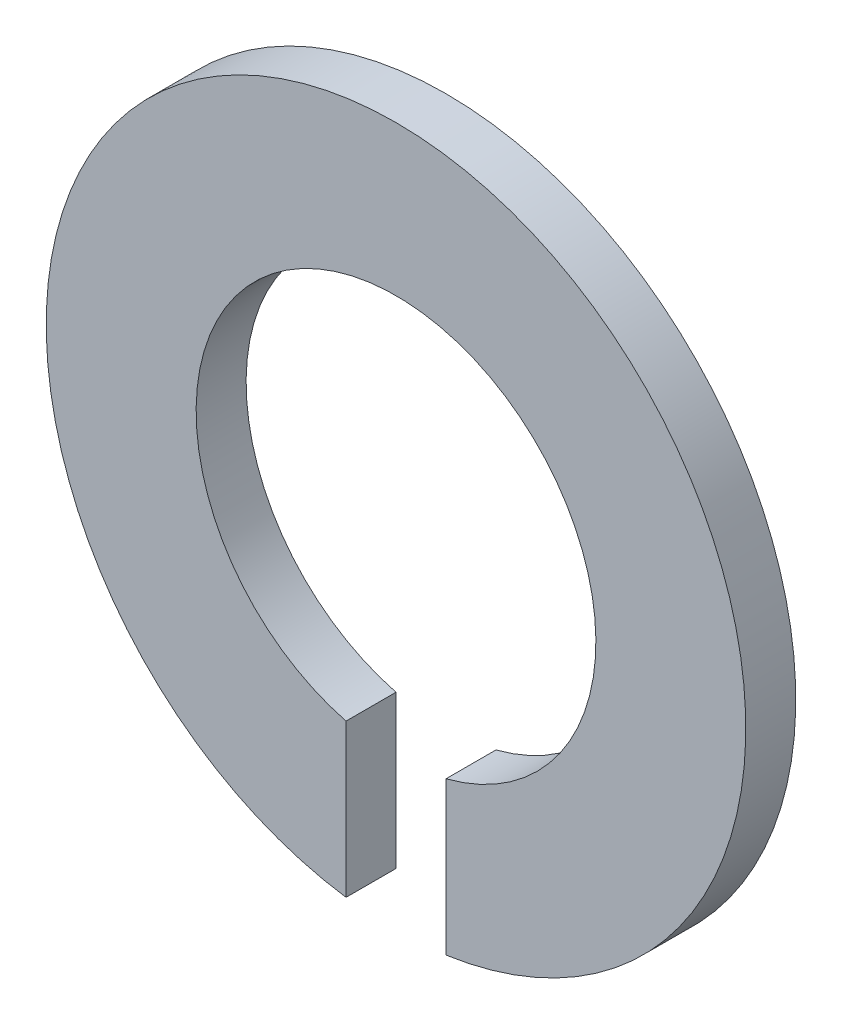
ISO-10303-21;
HEADER;
FILE_DESCRIPTION(('STEP AP214'),'2;1');
FILE_NAME('part.step','',(''),(''),'','','');
FILE_SCHEMA(('AUTOMOTIVE_DESIGN { 1 0 10303 214 1 1 1 1 }'));
ENDSEC;
DATA;
#1=APPLICATION_CONTEXT('core data for automotive mechanical design processes');
#2=APPLICATION_PROTOCOL_DEFINITION('international standard','automotive_design',2000,#1);
#3=PRODUCT_CONTEXT('',#1,'mechanical');
#4=PRODUCT('Part','Part','',(#3));
#5=PRODUCT_RELATED_PRODUCT_CATEGORY('part','',(#4));
#6=PRODUCT_DEFINITION_FORMATION('','',#4);
#7=PRODUCT_DEFINITION_CONTEXT('part definition',#1,'design');
#8=PRODUCT_DEFINITION('design','',#6,#7);
#9=PRODUCT_DEFINITION_SHAPE('','',#8);
#10=(LENGTH_UNIT() NAMED_UNIT(*) SI_UNIT(.MILLI.,.METRE.));
#11=(NAMED_UNIT(*) PLANE_ANGLE_UNIT() SI_UNIT($,.RADIAN.));
#12=(NAMED_UNIT(*) SI_UNIT($,.STERADIAN.) SOLID_ANGLE_UNIT());
#13=UNCERTAINTY_MEASURE_WITH_UNIT(LENGTH_MEASURE(1.E-05),#10,'distance_accuracy_value','');
#14=(GEOMETRIC_REPRESENTATION_CONTEXT(3) GLOBAL_UNCERTAINTY_ASSIGNED_CONTEXT((#13)) GLOBAL_UNIT_ASSIGNED_CONTEXT((#10,
#11,#12)) REPRESENTATION_CONTEXT('',''));
#15=CARTESIAN_POINT('',(0.,0.,0.));
#16=DIRECTION('',(0.,0.,1.));
#17=DIRECTION('',(1.,0.,0.));
#18=AXIS2_PLACEMENT_3D('',#15,#16,#17);
#19=CARTESIAN_POINT('',(0.,0.,0.5));
#20=DIRECTION('',(0.,0.,-1.));
#21=DIRECTION('',(-1.,0.,0.));
#22=AXIS2_PLACEMENT_3D('',#19,#20,#21);
#23=CYLINDRICAL_SURFACE('',#22,3.5);
#24=CARTESIAN_POINT('',(0.,0.,0.));
#25=DIRECTION('',(0.,0.,1.));
#26=DIRECTION('',(1.,0.,0.));
#27=AXIS2_PLACEMENT_3D('',#24,#25,#26);
#28=CIRCLE('',#27,3.5);
#29=CARTESIAN_POINT('',(0.5,-3.46410161513775,0.));
#30=VERTEX_POINT('',#29);
#31=CARTESIAN_POINT('',(-0.5,-3.46410161513775,0.));
#32=VERTEX_POINT('',#31);
#33=EDGE_CURVE('E113',#30,#32,#28,.T.);
#34=ORIENTED_EDGE('',*,*,#33,.T.);
#35=DIRECTION('',(0.,0.,-1.));
#36=VECTOR('',#35,1.);
#37=CARTESIAN_POINT('',(-0.5,-3.46410161513775,0.5));
#38=LINE('',#37,#36);
#39=CARTESIAN_POINT('',(-0.5,-3.46410161513775,0.5));
#40=VERTEX_POINT('',#39);
#41=EDGE_CURVE('E11',#40,#32,#38,.T.);
#42=ORIENTED_EDGE('',*,*,#41,.F.);
#43=CARTESIAN_POINT('',(0.,0.,0.5));
#44=DIRECTION('',(0.,0.,1.));
#45=DIRECTION('',(1.,0.,0.));
#46=AXIS2_PLACEMENT_3D('',#43,#44,#45);
#47=CIRCLE('',#46,3.5);
#48=CARTESIAN_POINT('',(0.5,-3.46410161513775,0.5));
#49=VERTEX_POINT('',#48);
#50=EDGE_CURVE('E97',#49,#40,#47,.T.);
#51=ORIENTED_EDGE('',*,*,#50,.F.);
#52=DIRECTION('',(0.,0.,-1.));
#53=VECTOR('',#52,1.);
#54=CARTESIAN_POINT('',(0.5,-3.46410161513775,0.5));
#55=LINE('',#54,#53);
#56=EDGE_CURVE('E109',#49,#30,#55,.T.);
#57=ORIENTED_EDGE('',*,*,#56,.T.);
#58=EDGE_LOOP('',(#34,#42,#51,#57));
#59=FACE_BOUND('',#58,.T.);
#60=ADVANCED_FACE('F45',(#59),#23,.T.);
#61=CARTESIAN_POINT('',(-0.5,-3.46410161513775,0.5));
#62=DIRECTION('',(-1.,0.,0.));
#63=DIRECTION('',(0.,0.,1.));
#64=AXIS2_PLACEMENT_3D('',#61,#62,#63);
#65=PLANE('',#64);
#66=DIRECTION('',(0.,1.,0.));
#67=VECTOR('',#66,1.);
#68=CARTESIAN_POINT('',(-0.5,-3.46410161513775,0.));
#69=LINE('',#68,#67);
#70=CARTESIAN_POINT('',(-0.5,-1.93649167310371,0.));
#71=VERTEX_POINT('',#70);
#72=EDGE_CURVE('E102',#32,#71,#69,.T.);
#73=ORIENTED_EDGE('',*,*,#72,.T.);
#74=DIRECTION('',(0.,0.,-1.));
#75=VECTOR('',#74,1.);
#76=CARTESIAN_POINT('',(-0.5,-1.93649167310371,0.5));
#77=LINE('',#76,#75);
#78=CARTESIAN_POINT('',(-0.5,-1.93649167310371,0.5));
#79=VERTEX_POINT('',#78);
#80=EDGE_CURVE('E54',#79,#71,#77,.T.);
#81=ORIENTED_EDGE('',*,*,#80,.F.);
#82=DIRECTION('',(0.,1.,0.));
#83=VECTOR('',#82,1.);
#84=CARTESIAN_POINT('',(-0.5,-3.46410161513775,0.5));
#85=LINE('',#84,#83);
#86=EDGE_CURVE('E92',#40,#79,#85,.T.);
#87=ORIENTED_EDGE('',*,*,#86,.F.);
#88=ORIENTED_EDGE('',*,*,#41,.T.);
#89=EDGE_LOOP('',(#73,#81,#87,#88));
#90=FACE_BOUND('',#89,.T.);
#91=ADVANCED_FACE('F101',(#90),#65,.F.);
#92=CARTESIAN_POINT('',(0.,0.,0.5));
#93=DIRECTION('',(0.,0.,-1.));
#94=DIRECTION('',(-1.,0.,0.));
#95=AXIS2_PLACEMENT_3D('',#92,#93,#94);
#96=CYLINDRICAL_SURFACE('',#95,2.);
#97=CARTESIAN_POINT('',(0.,0.,0.));
#98=DIRECTION('',(0.,0.,-1.));
#99=DIRECTION('',(1.,0.,0.));
#100=AXIS2_PLACEMENT_3D('',#97,#98,#99);
#101=CIRCLE('',#100,2.);
#102=CARTESIAN_POINT('',(0.5,-1.93649167310371,0.));
#103=VERTEX_POINT('',#102);
#104=EDGE_CURVE('E79',#71,#103,#101,.T.);
#105=ORIENTED_EDGE('',*,*,#104,.T.);
#106=DIRECTION('',(0.,0.,-1.));
#107=VECTOR('',#106,1.);
#108=CARTESIAN_POINT('',(0.5,-1.93649167310371,0.5));
#109=LINE('',#108,#107);
#110=CARTESIAN_POINT('',(0.5,-1.93649167310371,0.5));
#111=VERTEX_POINT('',#110);
#112=EDGE_CURVE('E104',#111,#103,#109,.T.);
#113=ORIENTED_EDGE('',*,*,#112,.F.);
#114=CARTESIAN_POINT('',(0.,0.,0.5));
#115=DIRECTION('',(0.,0.,-1.));
#116=DIRECTION('',(1.,0.,0.));
#117=AXIS2_PLACEMENT_3D('',#114,#115,#116);
#118=CIRCLE('',#117,2.);
#119=EDGE_CURVE('E95',#79,#111,#118,.T.);
#120=ORIENTED_EDGE('',*,*,#119,.F.);
#121=ORIENTED_EDGE('',*,*,#80,.T.);
#122=EDGE_LOOP('',(#105,#113,#120,#121));
#123=FACE_BOUND('',#122,.T.);
#124=ADVANCED_FACE('F105',(#123),#96,.F.);
#125=CARTESIAN_POINT('',(0.5,-3.46410161513775,0.5));
#126=DIRECTION('',(1.,0.,0.));
#127=DIRECTION('',(0.,1.,0.));
#128=AXIS2_PLACEMENT_3D('',#125,#126,#127);
#129=PLANE('',#128);
#130=DIRECTION('',(0.,-1.,0.));
#131=VECTOR('',#130,1.);
#132=CARTESIAN_POINT('',(0.5,-3.46410161513775,0.));
#133=LINE('',#132,#131);
#134=EDGE_CURVE('E85',#103,#30,#133,.T.);
#135=ORIENTED_EDGE('',*,*,#134,.T.);
#136=ORIENTED_EDGE('',*,*,#56,.F.);
#137=DIRECTION('',(0.,-1.,0.));
#138=VECTOR('',#137,1.);
#139=CARTESIAN_POINT('',(0.5,-3.46410161513775,0.5));
#140=LINE('',#139,#138);
#141=EDGE_CURVE('E62',#111,#49,#140,.T.);
#142=ORIENTED_EDGE('',*,*,#141,.F.);
#143=ORIENTED_EDGE('',*,*,#112,.T.);
#144=EDGE_LOOP('',(#135,#136,#142,#143));
#145=FACE_BOUND('',#144,.T.);
#146=ADVANCED_FACE('F126',(#145),#129,.F.);
#147=CARTESIAN_POINT('',(0.,0.,0.5));
#148=DIRECTION('',(0.,0.,1.));
#149=DIRECTION('',(1.,0.,0.));
#150=AXIS2_PLACEMENT_3D('',#147,#148,#149);
#151=PLANE('',#150);
#152=ORIENTED_EDGE('',*,*,#50,.T.);
#153=ORIENTED_EDGE('',*,*,#86,.T.);
#154=ORIENTED_EDGE('',*,*,#119,.T.);
#155=ORIENTED_EDGE('',*,*,#141,.T.);
#156=EDGE_LOOP('',(#152,#153,#154,#155));
#157=FACE_BOUND('',#156,.T.);
#158=ADVANCED_FACE('F93',(#157),#151,.T.);
#159=CARTESIAN_POINT('',(0.,0.,0.));
#160=DIRECTION('',(0.,0.,1.));
#161=DIRECTION('',(1.,0.,0.));
#162=AXIS2_PLACEMENT_3D('',#159,#160,#161);
#163=PLANE('',#162);
#164=ORIENTED_EDGE('',*,*,#33,.F.);
#165=ORIENTED_EDGE('',*,*,#134,.F.);
#166=ORIENTED_EDGE('',*,*,#104,.F.);
#167=ORIENTED_EDGE('',*,*,#72,.F.);
#168=EDGE_LOOP('',(#164,#165,#166,#167));
#169=FACE_BOUND('',#168,.T.);
#170=ADVANCED_FACE('F129',(#169),#163,.F.);
#171=CLOSED_SHELL('',(#60,#91,#124,#146,#158,#170));
#172=MANIFOLD_SOLID_BREP('B2',#171);
#173=ADVANCED_BREP_SHAPE_REPRESENTATION('',(#18,#172),#14);
#174=SHAPE_DEFINITION_REPRESENTATION(#9,#173);
ENDSEC;
END-ISO-10303-21;
